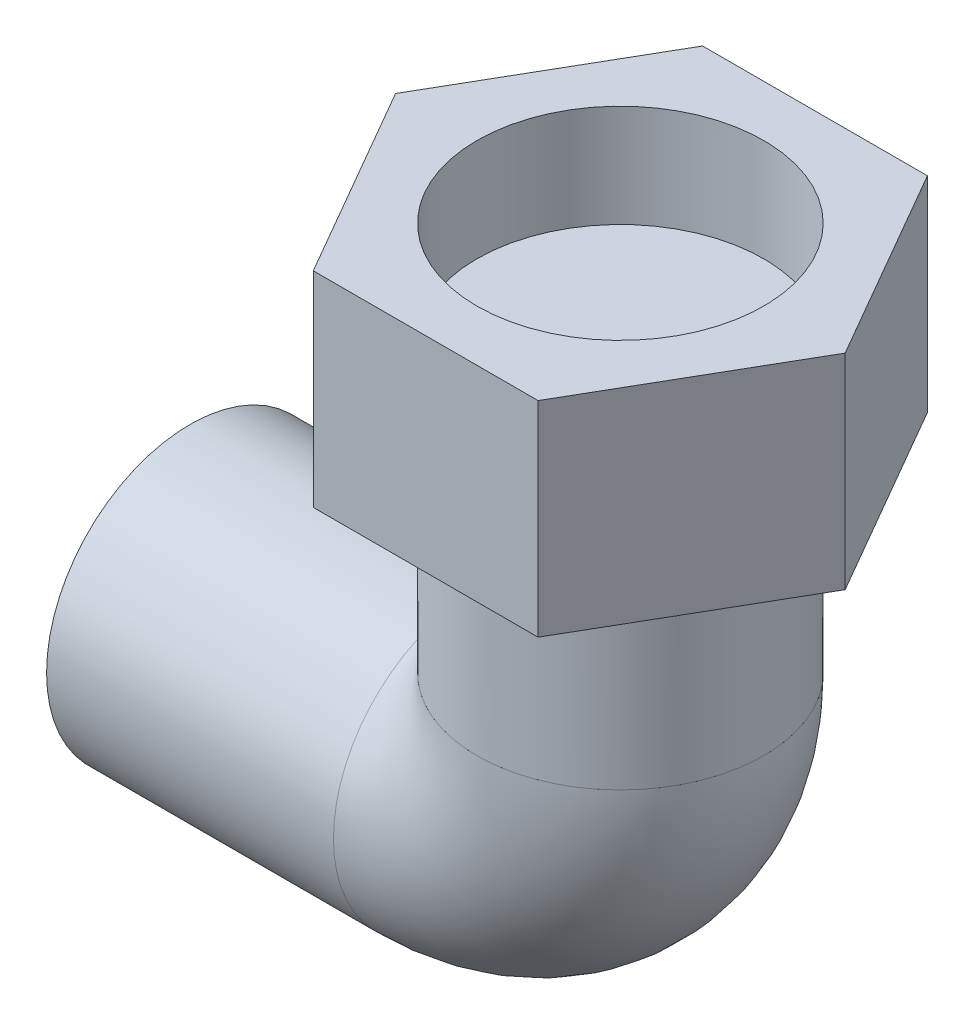
ISO-10303-21;
HEADER;
FILE_DESCRIPTION(('STEP AP214'),'2;1');
FILE_NAME('part.step','',(''),(''),'','','');
FILE_SCHEMA(('AUTOMOTIVE_DESIGN { 1 0 10303 214 1 1 1 1 }'));
ENDSEC;
DATA;
#1=APPLICATION_CONTEXT('core data for automotive mechanical design processes');
#2=APPLICATION_PROTOCOL_DEFINITION('international standard','automotive_design',2000,#1);
#3=PRODUCT_CONTEXT('',#1,'mechanical');
#4=PRODUCT('Part','Part','',(#3));
#5=PRODUCT_RELATED_PRODUCT_CATEGORY('part','',(#4));
#6=PRODUCT_DEFINITION_FORMATION('','',#4);
#7=PRODUCT_DEFINITION_CONTEXT('part definition',#1,'design');
#8=PRODUCT_DEFINITION('design','',#6,#7);
#9=PRODUCT_DEFINITION_SHAPE('','',#8);
#10=(LENGTH_UNIT() NAMED_UNIT(*) SI_UNIT(.MILLI.,.METRE.));
#11=(NAMED_UNIT(*) PLANE_ANGLE_UNIT() SI_UNIT($,.RADIAN.));
#12=(NAMED_UNIT(*) SI_UNIT($,.STERADIAN.) SOLID_ANGLE_UNIT());
#13=UNCERTAINTY_MEASURE_WITH_UNIT(LENGTH_MEASURE(1.E-05),#10,'distance_accuracy_value','');
#14=(GEOMETRIC_REPRESENTATION_CONTEXT(3) GLOBAL_UNCERTAINTY_ASSIGNED_CONTEXT((#13)) GLOBAL_UNIT_ASSIGNED_CONTEXT((#10,
#11,#12)) REPRESENTATION_CONTEXT('',''));
#15=CARTESIAN_POINT('',(0.,0.,0.));
#16=DIRECTION('',(0.,0.,1.));
#17=DIRECTION('',(1.,0.,0.));
#18=AXIS2_PLACEMENT_3D('',#15,#16,#17);
#19=CARTESIAN_POINT('',(14.,0.,0.));
#20=DIRECTION('',(1.,0.,0.));
#21=DIRECTION('',(0.,0.,-1.));
#22=AXIS2_PLACEMENT_3D('',#19,#20,#21);
#23=PLANE('',#22);
#24=CARTESIAN_POINT('',(14.,7.,0.));
#25=DIRECTION('',(-1.,0.,0.));
#26=DIRECTION('',(0.,0.,1.));
#27=AXIS2_PLACEMENT_3D('',#24,#25,#26);
#28=CIRCLE('',#27,7.);
#29=CARTESIAN_POINT('',(14.,13.9457146316279,0.870085200419799));
#30=VERTEX_POINT('',#29);
#31=CARTESIAN_POINT('',(14.,13.9348774307406,-0.952614833289934));
#32=VERTEX_POINT('',#31);
#33=EDGE_CURVE('E13',#30,#32,#28,.T.);
#34=ORIENTED_EDGE('',*,*,#33,.F.);
#35=DIRECTION('',(0.,-0.00594558025898862,-0.999982324881487));
#36=VECTOR('',#35,1.);
#37=CARTESIAN_POINT('',(14.,13.940048581712,-0.0828831426261377));
#38=LINE('',#37,#36);
#39=EDGE_CURVE('E186',#30,#32,#38,.T.);
#40=ORIENTED_EDGE('',*,*,#39,.T.);
#41=EDGE_LOOP('',(#34,#40));
#42=FACE_BOUND('',#41,.T.);
#43=ADVANCED_FACE('F151',(#42),#23,.T.);
#44=CARTESIAN_POINT('',(0.,7.,0.));
#45=DIRECTION('',(-1.,0.,0.));
#46=DIRECTION('',(0.,0.,1.));
#47=AXIS2_PLACEMENT_3D('',#44,#45,#46);
#48=CYLINDRICAL_SURFACE('',#47,7.);
#49=CARTESIAN_POINT('',(0.,7.,0.));
#50=DIRECTION('',(-1.,0.,0.));
#51=DIRECTION('',(0.,0.,1.));
#52=AXIS2_PLACEMENT_3D('',#49,#50,#51);
#53=CIRCLE('',#52,7.);
#54=CARTESIAN_POINT('',(0.,7.,7.));
#55=VERTEX_POINT('',#54);
#56=EDGE_CURVE('E159',#55,#55,#53,.T.);
#57=ORIENTED_EDGE('',*,*,#56,.F.);
#58=EDGE_LOOP('',(#57));
#59=FACE_BOUND('',#58,.T.);
#60=ORIENTED_EDGE('',*,*,#33,.T.);
#61=CARTESIAN_POINT('',(14.,7.,0.));
#62=DIRECTION('',(1.,0.,0.));
#63=DIRECTION('',(0.,0.,-1.));
#64=AXIS2_PLACEMENT_3D('',#61,#62,#63);
#65=CIRCLE('',#64,7.);
#66=EDGE_CURVE('E166',#30,#32,#65,.T.);
#67=ORIENTED_EDGE('',*,*,#66,.F.);
#68=EDGE_LOOP('',(#60,#67));
#69=FACE_BOUND('',#68,.T.);
#70=ADVANCED_FACE('F193',(#59,#69),#48,.T.);
#71=CARTESIAN_POINT('',(0.,0.,0.));
#72=DIRECTION('',(-1.,0.,0.));
#73=DIRECTION('',(0.,0.,1.));
#74=AXIS2_PLACEMENT_3D('',#71,#72,#73);
#75=PLANE('',#74);
#76=ORIENTED_EDGE('',*,*,#56,.T.);
#77=EDGE_LOOP('',(#76));
#78=FACE_BOUND('',#77,.T.);
#79=ADVANCED_FACE('F202',(#78),#75,.T.);
#80=CARTESIAN_POINT('',(14.,14.,0.870085200419799));
#81=DIRECTION('',(0.,0.,-1.));
#82=DIRECTION('',(-1.,0.,0.));
#83=AXIS2_PLACEMENT_3D('',#80,#81,#82);
#84=CONICAL_SURFACE('',#83,0.0542853683720614,0.00594561528884822);
#85=CARTESIAN_POINT('',(14.,14.,0.870085200419799));
#86=DIRECTION('',(0.,0.,-1.));
#87=DIRECTION('',(-1.,0.,0.));
#88=AXIS2_PLACEMENT_3D('',#85,#86,#87);
#89=CIRCLE('',#88,0.0542853683720614);
#90=CARTESIAN_POINT('',(14.0542853683721,14.,0.870085200419799));
#91=VERTEX_POINT('',#90);
#92=EDGE_CURVE('E176',#91,#30,#89,.T.);
#93=ORIENTED_EDGE('',*,*,#92,.F.);
#94=DIRECTION('',(0.00594558025898862,0.,-0.999982324881487));
#95=VECTOR('',#94,1.);
#96=CARTESIAN_POINT('',(14.059951418288,14.,-0.0828831426261377));
#97=LINE('',#96,#95);
#98=CARTESIAN_POINT('',(14.0651225692594,14.,-0.952614833289934));
#99=VERTEX_POINT('',#98);
#100=EDGE_CURVE('E195',#91,#99,#97,.T.);
#101=ORIENTED_EDGE('',*,*,#100,.T.);
#102=CARTESIAN_POINT('',(14.,14.,-0.952614833289933));
#103=DIRECTION('',(0.,0.,-1.));
#104=DIRECTION('',(-1.,0.,0.));
#105=AXIS2_PLACEMENT_3D('',#102,#103,#104);
#106=CIRCLE('',#105,0.065122569259354);
#107=EDGE_CURVE('E170',#99,#32,#106,.T.);
#108=ORIENTED_EDGE('',*,*,#107,.T.);
#109=ORIENTED_EDGE('',*,*,#39,.F.);
#110=EDGE_LOOP('',(#93,#101,#108,#109));
#111=FACE_BOUND('',#110,.T.);
#112=ADVANCED_FACE('F187',(#111),#84,.F.);
#113=CARTESIAN_POINT('',(14.,14.,0.));
#114=DIRECTION('',(0.,0.,-1.));
#115=DIRECTION('',(-1.,0.,0.));
#116=AXIS2_PLACEMENT_3D('',#113,#114,#115);
#117=TOROIDAL_SURFACE('',#116,7.,7.);
#118=CARTESIAN_POINT('',(21.,14.,0.));
#119=DIRECTION('',(0.,1.,0.));
#120=DIRECTION('',(0.,0.,-1.));
#121=AXIS2_PLACEMENT_3D('',#118,#119,#120);
#122=CIRCLE('',#121,7.);
#123=EDGE_CURVE('E180',#91,#99,#122,.T.);
#124=ORIENTED_EDGE('',*,*,#123,.F.);
#125=ORIENTED_EDGE('',*,*,#92,.T.);
#126=ORIENTED_EDGE('',*,*,#66,.T.);
#127=ORIENTED_EDGE('',*,*,#107,.F.);
#128=EDGE_LOOP('',(#124,#125,#126,#127));
#129=FACE_BOUND('',#128,.T.);
#130=ADVANCED_FACE('F178',(#129),#117,.T.);
#131=CARTESIAN_POINT('',(28.,14.,0.));
#132=DIRECTION('',(0.,1.,0.));
#133=DIRECTION('',(0.,0.,-1.));
#134=AXIS2_PLACEMENT_3D('',#131,#132,#133);
#135=PLANE('',#134);
#136=ORIENTED_EDGE('',*,*,#100,.F.);
#137=ORIENTED_EDGE('',*,*,#123,.T.);
#138=EDGE_LOOP('',(#136,#137));
#139=FACE_BOUND('',#138,.T.);
#140=ADVANCED_FACE('F213',(#139),#135,.T.);
#141=CLOSED_SHELL('',(#43,#70,#79,#112,#130,#140));
#142=MANIFOLD_SOLID_BREP('B2',#141);
#143=CARTESIAN_POINT('',(21.,28.,0.));
#144=DIRECTION('',(0.,1.,0.));
#145=DIRECTION('',(-1.,0.,0.));
#146=AXIS2_PLACEMENT_3D('',#143,#144,#145);
#147=CYLINDRICAL_SURFACE('',#146,7.);
#148=CARTESIAN_POINT('',(21.,14.,0.));
#149=DIRECTION('',(0.,1.,0.));
#150=DIRECTION('',(-1.,0.,0.));
#151=AXIS2_PLACEMENT_3D('',#148,#149,#150);
#152=CIRCLE('',#151,7.);
#153=CARTESIAN_POINT('',(14.,14.,0.));
#154=VERTEX_POINT('',#153);
#155=EDGE_CURVE('E283',#154,#154,#152,.T.);
#156=ORIENTED_EDGE('',*,*,#155,.T.);
#157=EDGE_LOOP('',(#156));
#158=FACE_BOUND('',#157,.T.);
#159=CARTESIAN_POINT('',(21.,23.,0.));
#160=DIRECTION('',(0.,1.,0.));
#161=DIRECTION('',(0.,0.,1.));
#162=AXIS2_PLACEMENT_3D('',#159,#160,#161);
#163=CIRCLE('',#162,7.);
#164=CARTESIAN_POINT('',(21.,23.,7.));
#165=VERTEX_POINT('',#164);
#166=EDGE_CURVE('E149',#165,#165,#163,.T.);
#167=ORIENTED_EDGE('',*,*,#166,.F.);
#168=EDGE_LOOP('',(#167));
#169=FACE_BOUND('',#168,.T.);
#170=ADVANCED_FACE('F274',(#158,#169),#147,.T.);
#171=CARTESIAN_POINT('',(0.,14.,0.));
#172=DIRECTION('',(0.,1.,0.));
#173=DIRECTION('',(-1.,0.,0.));
#174=AXIS2_PLACEMENT_3D('',#171,#172,#173);
#175=PLANE('',#174);
#176=ORIENTED_EDGE('',*,*,#155,.F.);
#177=EDGE_LOOP('',(#176));
#178=FACE_BOUND('',#177,.T.);
#179=ADVANCED_FACE('F276',(#178),#175,.F.);
#180=CARTESIAN_POINT('',(0.,33.,0.));
#181=DIRECTION('',(0.,1.,0.));
#182=DIRECTION('',(0.,0.,1.));
#183=AXIS2_PLACEMENT_3D('',#180,#181,#182);
#184=PLANE('',#183);
#185=DIRECTION('',(-0.5,0.,0.866025403784439));
#186=VECTOR('',#185,1.);
#187=CARTESIAN_POINT('',(7.52275866404783,33.,4.34326673973661));
#188=LINE('',#187,#186);
#189=CARTESIAN_POINT('',(15.5151724426986,33.,-9.5));
#190=VERTEX_POINT('',#189);
#191=CARTESIAN_POINT('',(10.0303448853971,33.,0.));
#192=VERTEX_POINT('',#191);
#193=EDGE_CURVE('E331',#190,#192,#188,.T.);
#194=ORIENTED_EDGE('',*,*,#193,.T.);
#195=DIRECTION('',(0.5,0.,0.866025403784439));
#196=VECTOR('',#195,1.);
#197=CARTESIAN_POINT('',(7.52275866404783,33.,-4.34326673973661));
#198=LINE('',#197,#196);
#199=CARTESIAN_POINT('',(15.5151724426986,33.,9.5));
#200=VERTEX_POINT('',#199);
#201=EDGE_CURVE('E341',#192,#200,#198,.T.);
#202=ORIENTED_EDGE('',*,*,#201,.T.);
#203=DIRECTION('',(1.,0.,0.));
#204=VECTOR('',#203,1.);
#205=CARTESIAN_POINT('',(0.,33.,9.5));
#206=LINE('',#205,#204);
#207=CARTESIAN_POINT('',(26.4848275573014,33.,9.5));
#208=VERTEX_POINT('',#207);
#209=EDGE_CURVE('E347',#200,#208,#206,.T.);
#210=ORIENTED_EDGE('',*,*,#209,.T.);
#211=DIRECTION('',(0.5,0.,-0.866025403784439));
#212=VECTOR('',#211,1.);
#213=CARTESIAN_POINT('',(23.9772413359522,33.,13.8432667397366));
#214=LINE('',#213,#212);
#215=CARTESIAN_POINT('',(31.9696551146029,33.,0.));
#216=VERTEX_POINT('',#215);
#217=EDGE_CURVE('E364',#208,#216,#214,.T.);
#218=ORIENTED_EDGE('',*,*,#217,.T.);
#219=DIRECTION('',(-0.5,0.,-0.866025403784439));
#220=VECTOR('',#219,1.);
#221=CARTESIAN_POINT('',(23.9772413359522,33.,-13.8432667397366));
#222=LINE('',#221,#220);
#223=CARTESIAN_POINT('',(26.4848275573014,33.,-9.5));
#224=VERTEX_POINT('',#223);
#225=EDGE_CURVE('E368',#216,#224,#222,.T.);
#226=ORIENTED_EDGE('',*,*,#225,.T.);
#227=DIRECTION('',(-1.,0.,0.));
#228=VECTOR('',#227,1.);
#229=CARTESIAN_POINT('',(0.,33.,-9.5));
#230=LINE('',#229,#228);
#231=EDGE_CURVE('E353',#224,#190,#230,.T.);
#232=ORIENTED_EDGE('',*,*,#231,.T.);
#233=EDGE_LOOP('',(#194,#202,#210,#218,#226,#232));
#234=FACE_BOUND('',#233,.T.);
#235=CARTESIAN_POINT('',(21.,33.,0.));
#236=DIRECTION('',(0.,1.,0.));
#237=DIRECTION('',(0.,0.,1.));
#238=AXIS2_PLACEMENT_3D('',#235,#236,#237);
#239=CIRCLE('',#238,7.);
#240=CARTESIAN_POINT('',(21.,33.,7.));
#241=VERTEX_POINT('',#240);
#242=EDGE_CURVE('E355',#241,#241,#239,.T.);
#243=ORIENTED_EDGE('',*,*,#242,.F.);
#244=EDGE_LOOP('',(#243));
#245=FACE_BOUND('',#244,.T.);
#246=ADVANCED_FACE('F350',(#234,#245),#184,.T.);
#247=CARTESIAN_POINT('',(21.,33.,0.));
#248=DIRECTION('',(0.,-1.,0.));
#249=DIRECTION('',(0.,0.,-1.));
#250=AXIS2_PLACEMENT_3D('',#247,#248,#249);
#251=CYLINDRICAL_SURFACE('',#250,7.);
#252=CARTESIAN_POINT('',(21.,28.,0.));
#253=DIRECTION('',(0.,1.,0.));
#254=DIRECTION('',(-1.,0.,0.));
#255=AXIS2_PLACEMENT_3D('',#252,#253,#254);
#256=CIRCLE('',#255,7.);
#257=CARTESIAN_POINT('',(14.,28.,0.));
#258=VERTEX_POINT('',#257);
#259=EDGE_CURVE('E393',#258,#258,#256,.F.);
#260=ORIENTED_EDGE('',*,*,#259,.T.);
#261=EDGE_LOOP('',(#260));
#262=FACE_BOUND('',#261,.T.);
#263=ORIENTED_EDGE('',*,*,#242,.T.);
#264=EDGE_LOOP('',(#263));
#265=FACE_BOUND('',#264,.T.);
#266=ADVANCED_FACE('F418',(#262,#265),#251,.F.);
#267=CARTESIAN_POINT('',(7.52275866404783,23.,4.34326673973661));
#268=DIRECTION('',(-0.866025403784439,0.,-0.5));
#269=DIRECTION('',(-0.5,0.,0.866025403784439));
#270=AXIS2_PLACEMENT_3D('',#267,#268,#269);
#271=PLANE('',#270);
#272=DIRECTION('',(0.,1.,0.));
#273=VECTOR('',#272,1.);
#274=CARTESIAN_POINT('',(10.0303448853971,23.,0.));
#275=LINE('',#274,#273);
#276=CARTESIAN_POINT('',(10.0303448853971,23.,0.));
#277=VERTEX_POINT('',#276);
#278=EDGE_CURVE('E327',#277,#192,#275,.T.);
#279=ORIENTED_EDGE('',*,*,#278,.T.);
#280=ORIENTED_EDGE('',*,*,#193,.F.);
#281=DIRECTION('',(0.,1.,0.));
#282=VECTOR('',#281,1.);
#283=CARTESIAN_POINT('',(15.5151724426986,23.,-9.5));
#284=LINE('',#283,#282);
#285=CARTESIAN_POINT('',(15.5151724426986,23.,-9.5));
#286=VERTEX_POINT('',#285);
#287=EDGE_CURVE('E290',#286,#190,#284,.T.);
#288=ORIENTED_EDGE('',*,*,#287,.F.);
#289=DIRECTION('',(-0.5,0.,0.866025403784439));
#290=VECTOR('',#289,1.);
#291=CARTESIAN_POINT('',(7.52275866404783,23.,4.34326673973661));
#292=LINE('',#291,#290);
#293=EDGE_CURVE('E332',#286,#277,#292,.T.);
#294=ORIENTED_EDGE('',*,*,#293,.T.);
#295=EDGE_LOOP('',(#279,#280,#288,#294));
#296=FACE_BOUND('',#295,.T.);
#297=ADVANCED_FACE('F329',(#296),#271,.T.);
#298=CARTESIAN_POINT('',(0.,23.,-9.5));
#299=DIRECTION('',(0.,0.,-1.));
#300=DIRECTION('',(-1.,0.,0.));
#301=AXIS2_PLACEMENT_3D('',#298,#299,#300);
#302=PLANE('',#301);
#303=ORIENTED_EDGE('',*,*,#287,.T.);
#304=ORIENTED_EDGE('',*,*,#231,.F.);
#305=DIRECTION('',(0.,1.,0.));
#306=VECTOR('',#305,1.);
#307=CARTESIAN_POINT('',(26.4848275573014,23.,-9.5));
#308=LINE('',#307,#306);
#309=CARTESIAN_POINT('',(26.4848275573014,23.,-9.5));
#310=VERTEX_POINT('',#309);
#311=EDGE_CURVE('E298',#310,#224,#308,.T.);
#312=ORIENTED_EDGE('',*,*,#311,.F.);
#313=DIRECTION('',(-1.,0.,0.));
#314=VECTOR('',#313,1.);
#315=CARTESIAN_POINT('',(0.,23.,-9.5));
#316=LINE('',#315,#314);
#317=EDGE_CURVE('E338',#310,#286,#316,.T.);
#318=ORIENTED_EDGE('',*,*,#317,.T.);
#319=EDGE_LOOP('',(#303,#304,#312,#318));
#320=FACE_BOUND('',#319,.T.);
#321=ADVANCED_FACE('F430',(#320),#302,.T.);
#322=CARTESIAN_POINT('',(23.9772413359522,23.,-13.8432667397366));
#323=DIRECTION('',(0.866025403784438,0.,-0.5));
#324=DIRECTION('',(-0.5,0.,-0.866025403784438));
#325=AXIS2_PLACEMENT_3D('',#322,#323,#324);
#326=PLANE('',#325);
#327=ORIENTED_EDGE('',*,*,#311,.T.);
#328=ORIENTED_EDGE('',*,*,#225,.F.);
#329=DIRECTION('',(0.,1.,0.));
#330=VECTOR('',#329,1.);
#331=CARTESIAN_POINT('',(31.9696551146029,23.,0.));
#332=LINE('',#331,#330);
#333=CARTESIAN_POINT('',(31.9696551146029,23.,0.));
#334=VERTEX_POINT('',#333);
#335=EDGE_CURVE('E396',#334,#216,#332,.T.);
#336=ORIENTED_EDGE('',*,*,#335,.F.);
#337=DIRECTION('',(-0.5,0.,-0.866025403784439));
#338=VECTOR('',#337,1.);
#339=CARTESIAN_POINT('',(23.9772413359522,23.,-13.8432667397366));
#340=LINE('',#339,#338);
#341=EDGE_CURVE('E386',#334,#310,#340,.T.);
#342=ORIENTED_EDGE('',*,*,#341,.T.);
#343=EDGE_LOOP('',(#327,#328,#336,#342));
#344=FACE_BOUND('',#343,.T.);
#345=ADVANCED_FACE('F440',(#344),#326,.T.);
#346=CARTESIAN_POINT('',(23.9772413359522,23.,13.8432667397366));
#347=DIRECTION('',(0.866025403784439,0.,0.5));
#348=DIRECTION('',(0.5,0.,-0.866025403784439));
#349=AXIS2_PLACEMENT_3D('',#346,#347,#348);
#350=PLANE('',#349);
#351=ORIENTED_EDGE('',*,*,#335,.T.);
#352=ORIENTED_EDGE('',*,*,#217,.F.);
#353=DIRECTION('',(0.,1.,0.));
#354=VECTOR('',#353,1.);
#355=CARTESIAN_POINT('',(26.4848275573014,23.,9.5));
#356=LINE('',#355,#354);
#357=CARTESIAN_POINT('',(26.4848275573014,23.,9.5));
#358=VERTEX_POINT('',#357);
#359=EDGE_CURVE('E399',#358,#208,#356,.T.);
#360=ORIENTED_EDGE('',*,*,#359,.F.);
#361=DIRECTION('',(0.5,0.,-0.866025403784439));
#362=VECTOR('',#361,1.);
#363=CARTESIAN_POINT('',(23.9772413359522,23.,13.8432667397366));
#364=LINE('',#363,#362);
#365=EDGE_CURVE('E382',#358,#334,#364,.T.);
#366=ORIENTED_EDGE('',*,*,#365,.T.);
#367=EDGE_LOOP('',(#351,#352,#360,#366));
#368=FACE_BOUND('',#367,.T.);
#369=ADVANCED_FACE('F436',(#368),#350,.T.);
#370=CARTESIAN_POINT('',(0.,23.,9.5));
#371=DIRECTION('',(0.,0.,1.));
#372=DIRECTION('',(1.,0.,0.));
#373=AXIS2_PLACEMENT_3D('',#370,#371,#372);
#374=PLANE('',#373);
#375=ORIENTED_EDGE('',*,*,#359,.T.);
#376=ORIENTED_EDGE('',*,*,#209,.F.);
#377=DIRECTION('',(0.,1.,0.));
#378=VECTOR('',#377,1.);
#379=CARTESIAN_POINT('',(15.5151724426986,23.,9.5));
#380=LINE('',#379,#378);
#381=CARTESIAN_POINT('',(15.5151724426986,23.,9.5));
#382=VERTEX_POINT('',#381);
#383=EDGE_CURVE('E337',#382,#200,#380,.T.);
#384=ORIENTED_EDGE('',*,*,#383,.F.);
#385=DIRECTION('',(1.,0.,0.));
#386=VECTOR('',#385,1.);
#387=CARTESIAN_POINT('',(0.,23.,9.5));
#388=LINE('',#387,#386);
#389=EDGE_CURVE('E378',#382,#358,#388,.T.);
#390=ORIENTED_EDGE('',*,*,#389,.T.);
#391=EDGE_LOOP('',(#375,#376,#384,#390));
#392=FACE_BOUND('',#391,.T.);
#393=ADVANCED_FACE('F433',(#392),#374,.T.);
#394=CARTESIAN_POINT('',(7.52275866404783,23.,-4.34326673973661));
#395=DIRECTION('',(-0.866025403784439,0.,0.5));
#396=DIRECTION('',(0.5,0.,0.866025403784439));
#397=AXIS2_PLACEMENT_3D('',#394,#395,#396);
#398=PLANE('',#397);
#399=ORIENTED_EDGE('',*,*,#383,.T.);
#400=ORIENTED_EDGE('',*,*,#201,.F.);
#401=ORIENTED_EDGE('',*,*,#278,.F.);
#402=DIRECTION('',(0.5,0.,0.866025403784439));
#403=VECTOR('',#402,1.);
#404=CARTESIAN_POINT('',(7.52275866404783,23.,-4.34326673973661));
#405=LINE('',#404,#403);
#406=EDGE_CURVE('E375',#277,#382,#405,.T.);
#407=ORIENTED_EDGE('',*,*,#406,.T.);
#408=EDGE_LOOP('',(#399,#400,#401,#407));
#409=FACE_BOUND('',#408,.T.);
#410=ADVANCED_FACE('F342',(#409),#398,.T.);
#411=CARTESIAN_POINT('',(0.,23.,0.));
#412=DIRECTION('',(0.,1.,0.));
#413=DIRECTION('',(0.,0.,1.));
#414=AXIS2_PLACEMENT_3D('',#411,#412,#413);
#415=PLANE('',#414);
#416=ORIENTED_EDGE('',*,*,#293,.F.);
#417=ORIENTED_EDGE('',*,*,#317,.F.);
#418=ORIENTED_EDGE('',*,*,#341,.F.);
#419=ORIENTED_EDGE('',*,*,#365,.F.);
#420=ORIENTED_EDGE('',*,*,#389,.F.);
#421=ORIENTED_EDGE('',*,*,#406,.F.);
#422=EDGE_LOOP('',(#416,#417,#418,#419,#420,#421));
#423=FACE_BOUND('',#422,.T.);
#424=ORIENTED_EDGE('',*,*,#166,.T.);
#425=EDGE_LOOP('',(#424));
#426=FACE_BOUND('',#425,.T.);
#427=ADVANCED_FACE('F426',(#423,#426),#415,.F.);
#428=CARTESIAN_POINT('',(0.,28.,0.));
#429=DIRECTION('',(0.,1.,0.));
#430=DIRECTION('',(-1.,0.,0.));
#431=AXIS2_PLACEMENT_3D('',#428,#429,#430);
#432=PLANE('',#431);
#433=ORIENTED_EDGE('',*,*,#259,.F.);
#434=EDGE_LOOP('',(#433));
#435=FACE_BOUND('',#434,.T.);
#436=ADVANCED_FACE('F424',(#435),#432,.T.);
#437=CLOSED_SHELL('',(#170,#179,#246,#266,#297,#321,#345,#369,#393,#410,#427,#436));
#438=MANIFOLD_SOLID_BREP('B7',#437);
#439=ADVANCED_BREP_SHAPE_REPRESENTATION('',(#18,#142,#438),#14);
#440=SHAPE_DEFINITION_REPRESENTATION(#9,#439);
ENDSEC;
END-ISO-10303-21;
